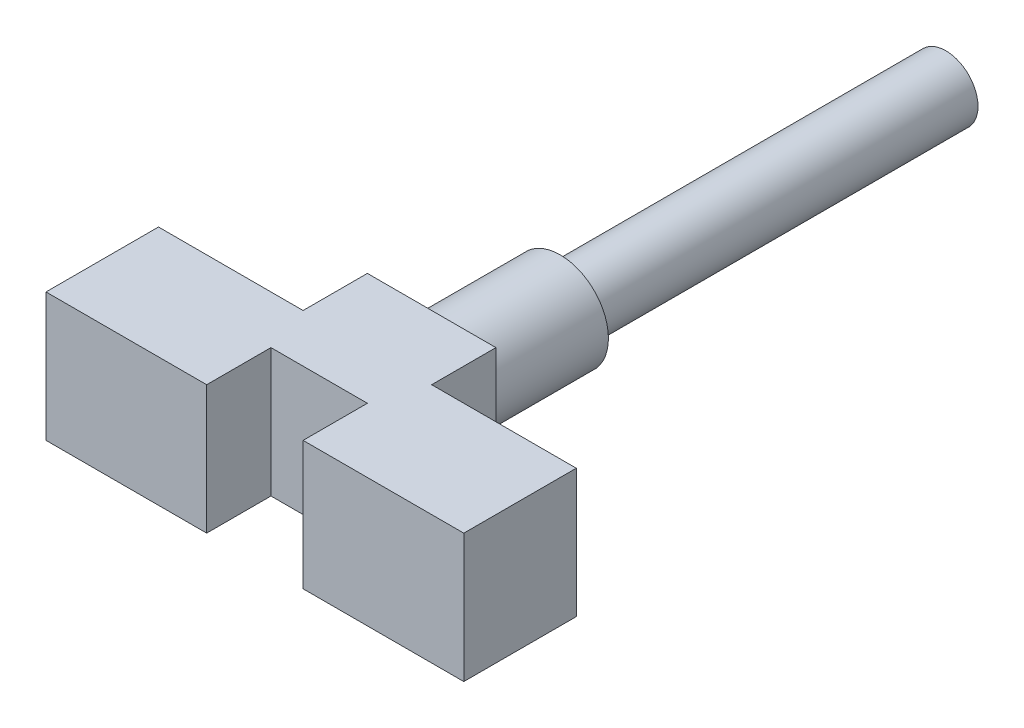
ISO-10303-21;
HEADER;
FILE_DESCRIPTION(('STEP AP214'),'2;1');
FILE_NAME('part.step','',(''),(''),'','','');
FILE_SCHEMA(('AUTOMOTIVE_DESIGN { 1 0 10303 214 1 1 1 1 }'));
ENDSEC;
DATA;
#1=APPLICATION_CONTEXT('core data for automotive mechanical design processes');
#2=APPLICATION_PROTOCOL_DEFINITION('international standard','automotive_design',2000,#1);
#3=PRODUCT_CONTEXT('',#1,'mechanical');
#4=PRODUCT('Part','Part','',(#3));
#5=PRODUCT_RELATED_PRODUCT_CATEGORY('part','',(#4));
#6=PRODUCT_DEFINITION_FORMATION('','',#4);
#7=PRODUCT_DEFINITION_CONTEXT('part definition',#1,'design');
#8=PRODUCT_DEFINITION('design','',#6,#7);
#9=PRODUCT_DEFINITION_SHAPE('','',#8);
#10=(LENGTH_UNIT() NAMED_UNIT(*) SI_UNIT(.MILLI.,.METRE.));
#11=(NAMED_UNIT(*) PLANE_ANGLE_UNIT() SI_UNIT($,.RADIAN.));
#12=(NAMED_UNIT(*) SI_UNIT($,.STERADIAN.) SOLID_ANGLE_UNIT());
#13=UNCERTAINTY_MEASURE_WITH_UNIT(LENGTH_MEASURE(1.E-05),#10,'distance_accuracy_value','');
#14=(GEOMETRIC_REPRESENTATION_CONTEXT(3) GLOBAL_UNCERTAINTY_ASSIGNED_CONTEXT((#13)) GLOBAL_UNIT_ASSIGNED_CONTEXT((#10,
#11,#12)) REPRESENTATION_CONTEXT('',''));
#15=CARTESIAN_POINT('',(0.,0.,0.));
#16=DIRECTION('',(0.,0.,1.));
#17=DIRECTION('',(1.,0.,0.));
#18=AXIS2_PLACEMENT_3D('',#15,#16,#17);
#19=CARTESIAN_POINT('',(0.,0.,-38.1));
#20=DIRECTION('',(0.,0.,-1.));
#21=DIRECTION('',(-1.,0.,0.));
#22=AXIS2_PLACEMENT_3D('',#19,#20,#21);
#23=PLANE('',#22);
#24=CARTESIAN_POINT('',(0.,0.,-38.1));
#25=DIRECTION('',(0.,0.,-1.));
#26=DIRECTION('',(-1.,0.,0.));
#27=AXIS2_PLACEMENT_3D('',#24,#25,#26);
#28=CIRCLE('',#27,9.525);
#29=CARTESIAN_POINT('',(-9.525,0.,-38.1));
#30=VERTEX_POINT('',#29);
#31=EDGE_CURVE('E157',#30,#30,#28,.T.);
#32=ORIENTED_EDGE('',*,*,#31,.T.);
#33=EDGE_LOOP('',(#32));
#34=FACE_BOUND('',#33,.T.);
#35=CARTESIAN_POINT('',(0.,0.,-38.1));
#36=DIRECTION('',(0.,0.,-1.));
#37=DIRECTION('',(-1.,0.,0.));
#38=AXIS2_PLACEMENT_3D('',#35,#36,#37);
#39=CIRCLE('',#38,6.35);
#40=CARTESIAN_POINT('',(6.35,0.,-38.1));
#41=VERTEX_POINT('',#40);
#42=EDGE_CURVE('E409',#41,#41,#39,.T.);
#43=ORIENTED_EDGE('',*,*,#42,.F.);
#44=EDGE_LOOP('',(#43));
#45=FACE_BOUND('',#44,.T.);
#46=ADVANCED_FACE('F31',(#34,#45),#23,.T.);
#47=CARTESIAN_POINT('',(12.7,12.7,-12.7));
#48=DIRECTION('',(0.,0.,1.));
#49=DIRECTION('',(1.,0.,0.));
#50=AXIS2_PLACEMENT_3D('',#47,#48,#49);
#51=PLANE('',#50);
#52=DIRECTION('',(-1.,0.,0.));
#53=VECTOR('',#52,1.);
#54=CARTESIAN_POINT('',(12.7,-12.7,-12.7));
#55=LINE('',#54,#53);
#56=CARTESIAN_POINT('',(12.7,-12.7,-12.7));
#57=VERTEX_POINT('',#56);
#58=CARTESIAN_POINT('',(-12.7,-12.7,-12.7));
#59=VERTEX_POINT('',#58);
#60=EDGE_CURVE('E156',#57,#59,#55,.T.);
#61=ORIENTED_EDGE('',*,*,#60,.T.);
#62=DIRECTION('',(0.,-1.,0.));
#63=VECTOR('',#62,1.);
#64=CARTESIAN_POINT('',(-12.7,12.7,-12.7));
#65=LINE('',#64,#63);
#66=CARTESIAN_POINT('',(-12.7,12.7,-12.7));
#67=VERTEX_POINT('',#66);
#68=EDGE_CURVE('E198',#67,#59,#65,.T.);
#69=ORIENTED_EDGE('',*,*,#68,.F.);
#70=DIRECTION('',(-1.,0.,0.));
#71=VECTOR('',#70,1.);
#72=CARTESIAN_POINT('',(12.7,12.7,-12.7));
#73=LINE('',#72,#71);
#74=CARTESIAN_POINT('',(12.7,12.7,-12.7));
#75=VERTEX_POINT('',#74);
#76=EDGE_CURVE('E104',#75,#67,#73,.T.);
#77=ORIENTED_EDGE('',*,*,#76,.F.);
#78=DIRECTION('',(0.,-1.,0.));
#79=VECTOR('',#78,1.);
#80=CARTESIAN_POINT('',(12.7,12.7,-12.7));
#81=LINE('',#80,#79);
#82=EDGE_CURVE('E40',#75,#57,#81,.T.);
#83=ORIENTED_EDGE('',*,*,#82,.T.);
#84=EDGE_LOOP('',(#61,#69,#77,#83));
#85=FACE_BOUND('',#84,.T.);
#86=CARTESIAN_POINT('',(0.,0.,-12.7));
#87=DIRECTION('',(0.,0.,1.));
#88=DIRECTION('',(1.,0.,0.));
#89=AXIS2_PLACEMENT_3D('',#86,#87,#88);
#90=CIRCLE('',#89,9.525);
#91=CARTESIAN_POINT('',(9.525,0.,-12.7));
#92=VERTEX_POINT('',#91);
#93=EDGE_CURVE('E11',#92,#92,#90,.F.);
#94=ORIENTED_EDGE('',*,*,#93,.F.);
#95=EDGE_LOOP('',(#94));
#96=FACE_BOUND('',#95,.T.);
#97=ADVANCED_FACE('F201',(#85,#96),#51,.F.);
#98=CARTESIAN_POINT('',(12.7,12.7,0.));
#99=DIRECTION('',(-1.,0.,0.));
#100=DIRECTION('',(0.,0.,1.));
#101=AXIS2_PLACEMENT_3D('',#98,#99,#100);
#102=PLANE('',#101);
#103=DIRECTION('',(0.,0.,-1.));
#104=VECTOR('',#103,1.);
#105=CARTESIAN_POINT('',(12.7,-12.7,0.));
#106=LINE('',#105,#104);
#107=CARTESIAN_POINT('',(12.7,-12.7,0.));
#108=VERTEX_POINT('',#107);
#109=EDGE_CURVE('E153',#108,#57,#106,.T.);
#110=ORIENTED_EDGE('',*,*,#109,.T.);
#111=ORIENTED_EDGE('',*,*,#82,.F.);
#112=DIRECTION('',(0.,0.,-1.));
#113=VECTOR('',#112,1.);
#114=CARTESIAN_POINT('',(12.7,12.7,0.));
#115=LINE('',#114,#113);
#116=CARTESIAN_POINT('',(12.7,12.7,0.));
#117=VERTEX_POINT('',#116);
#118=EDGE_CURVE('E176',#117,#75,#115,.T.);
#119=ORIENTED_EDGE('',*,*,#118,.F.);
#120=DIRECTION('',(0.,-1.,0.));
#121=VECTOR('',#120,1.);
#122=CARTESIAN_POINT('',(12.7,12.7,0.));
#123=LINE('',#122,#121);
#124=EDGE_CURVE('E149',#117,#108,#123,.T.);
#125=ORIENTED_EDGE('',*,*,#124,.T.);
#126=EDGE_LOOP('',(#110,#111,#119,#125));
#127=FACE_BOUND('',#126,.T.);
#128=ADVANCED_FACE('F33',(#127),#102,.F.);
#129=CARTESIAN_POINT('',(-12.7,12.7,-12.7));
#130=DIRECTION('',(1.,0.,0.));
#131=DIRECTION('',(0.,0.,-1.));
#132=AXIS2_PLACEMENT_3D('',#129,#130,#131);
#133=PLANE('',#132);
#134=DIRECTION('',(0.,0.,1.));
#135=VECTOR('',#134,1.);
#136=CARTESIAN_POINT('',(-12.7,-12.7,-12.7));
#137=LINE('',#136,#135);
#138=CARTESIAN_POINT('',(-12.7,-12.7,0.));
#139=VERTEX_POINT('',#138);
#140=EDGE_CURVE('E159',#59,#139,#137,.T.);
#141=ORIENTED_EDGE('',*,*,#140,.T.);
#142=DIRECTION('',(0.,-1.,0.));
#143=VECTOR('',#142,1.);
#144=CARTESIAN_POINT('',(-12.7,12.7,0.));
#145=LINE('',#144,#143);
#146=CARTESIAN_POINT('',(-12.7,12.7,0.));
#147=VERTEX_POINT('',#146);
#148=EDGE_CURVE('E195',#147,#139,#145,.T.);
#149=ORIENTED_EDGE('',*,*,#148,.F.);
#150=DIRECTION('',(0.,0.,1.));
#151=VECTOR('',#150,1.);
#152=CARTESIAN_POINT('',(-12.7,12.7,-12.7));
#153=LINE('',#152,#151);
#154=EDGE_CURVE('E222',#67,#147,#153,.T.);
#155=ORIENTED_EDGE('',*,*,#154,.F.);
#156=ORIENTED_EDGE('',*,*,#68,.T.);
#157=EDGE_LOOP('',(#141,#149,#155,#156));
#158=FACE_BOUND('',#157,.T.);
#159=ADVANCED_FACE('F213',(#158),#133,.F.);
#160=CARTESIAN_POINT('',(-12.7,12.7,0.));
#161=DIRECTION('',(0.,0.,1.));
#162=DIRECTION('',(1.,0.,0.));
#163=AXIS2_PLACEMENT_3D('',#160,#161,#162);
#164=PLANE('',#163);
#165=DIRECTION('',(-1.,0.,0.));
#166=VECTOR('',#165,1.);
#167=CARTESIAN_POINT('',(-12.7,-12.7,0.));
#168=LINE('',#167,#166);
#169=CARTESIAN_POINT('',(-41.275,-12.7,0.));
#170=VERTEX_POINT('',#169);
#171=EDGE_CURVE('E161',#139,#170,#168,.T.);
#172=ORIENTED_EDGE('',*,*,#171,.T.);
#173=DIRECTION('',(0.,-1.,0.));
#174=VECTOR('',#173,1.);
#175=CARTESIAN_POINT('',(-41.275,12.7,0.));
#176=LINE('',#175,#174);
#177=CARTESIAN_POINT('',(-41.275,12.7,0.));
#178=VERTEX_POINT('',#177);
#179=EDGE_CURVE('E192',#178,#170,#176,.T.);
#180=ORIENTED_EDGE('',*,*,#179,.F.);
#181=DIRECTION('',(-1.,0.,0.));
#182=VECTOR('',#181,1.);
#183=CARTESIAN_POINT('',(-12.7,12.7,0.));
#184=LINE('',#183,#182);
#185=EDGE_CURVE('E219',#147,#178,#184,.T.);
#186=ORIENTED_EDGE('',*,*,#185,.F.);
#187=ORIENTED_EDGE('',*,*,#148,.T.);
#188=EDGE_LOOP('',(#172,#180,#186,#187));
#189=FACE_BOUND('',#188,.T.);
#190=ADVANCED_FACE('F217',(#189),#164,.F.);
#191=CARTESIAN_POINT('',(-41.275,12.7,0.));
#192=DIRECTION('',(1.,0.,0.));
#193=DIRECTION('',(0.,0.,-1.));
#194=AXIS2_PLACEMENT_3D('',#191,#192,#193);
#195=PLANE('',#194);
#196=DIRECTION('',(0.,0.,1.));
#197=VECTOR('',#196,1.);
#198=CARTESIAN_POINT('',(-41.275,-12.7,0.));
#199=LINE('',#198,#197);
#200=CARTESIAN_POINT('',(-41.275,-12.7,22.225));
#201=VERTEX_POINT('',#200);
#202=EDGE_CURVE('E163',#170,#201,#199,.T.);
#203=ORIENTED_EDGE('',*,*,#202,.T.);
#204=DIRECTION('',(0.,-1.,0.));
#205=VECTOR('',#204,1.);
#206=CARTESIAN_POINT('',(-41.275,12.7,22.225));
#207=LINE('',#206,#205);
#208=CARTESIAN_POINT('',(-41.275,12.7,22.225));
#209=VERTEX_POINT('',#208);
#210=EDGE_CURVE('E189',#209,#201,#207,.T.);
#211=ORIENTED_EDGE('',*,*,#210,.F.);
#212=DIRECTION('',(0.,0.,1.));
#213=VECTOR('',#212,1.);
#214=CARTESIAN_POINT('',(-41.275,12.7,0.));
#215=LINE('',#214,#213);
#216=EDGE_CURVE('E221',#178,#209,#215,.T.);
#217=ORIENTED_EDGE('',*,*,#216,.F.);
#218=ORIENTED_EDGE('',*,*,#179,.T.);
#219=EDGE_LOOP('',(#203,#211,#217,#218));
#220=FACE_BOUND('',#219,.T.);
#221=ADVANCED_FACE('F253',(#220),#195,.F.);
#222=CARTESIAN_POINT('',(-41.275,12.7,22.225));
#223=DIRECTION('',(0.,0.,-1.));
#224=DIRECTION('',(-1.,0.,0.));
#225=AXIS2_PLACEMENT_3D('',#222,#223,#224);
#226=PLANE('',#225);
#227=DIRECTION('',(1.,0.,0.));
#228=VECTOR('',#227,1.);
#229=CARTESIAN_POINT('',(-41.275,-12.7,22.225));
#230=LINE('',#229,#228);
#231=CARTESIAN_POINT('',(-9.525,-12.7,22.225));
#232=VERTEX_POINT('',#231);
#233=EDGE_CURVE('E165',#201,#232,#230,.T.);
#234=ORIENTED_EDGE('',*,*,#233,.T.);
#235=DIRECTION('',(0.,-1.,0.));
#236=VECTOR('',#235,1.);
#237=CARTESIAN_POINT('',(-9.525,12.7,22.225));
#238=LINE('',#237,#236);
#239=CARTESIAN_POINT('',(-9.525,12.7,22.225));
#240=VERTEX_POINT('',#239);
#241=EDGE_CURVE('E186',#240,#232,#238,.T.);
#242=ORIENTED_EDGE('',*,*,#241,.F.);
#243=DIRECTION('',(1.,0.,0.));
#244=VECTOR('',#243,1.);
#245=CARTESIAN_POINT('',(-41.275,12.7,22.225));
#246=LINE('',#245,#244);
#247=EDGE_CURVE('E224',#209,#240,#246,.T.);
#248=ORIENTED_EDGE('',*,*,#247,.F.);
#249=ORIENTED_EDGE('',*,*,#210,.T.);
#250=EDGE_LOOP('',(#234,#242,#248,#249));
#251=FACE_BOUND('',#250,.T.);
#252=ADVANCED_FACE('F250',(#251),#226,.F.);
#253=CARTESIAN_POINT('',(-9.525,12.7,22.225));
#254=DIRECTION('',(-1.,0.,0.));
#255=DIRECTION('',(0.,0.,1.));
#256=AXIS2_PLACEMENT_3D('',#253,#254,#255);
#257=PLANE('',#256);
#258=DIRECTION('',(0.,0.,-1.));
#259=VECTOR('',#258,1.);
#260=CARTESIAN_POINT('',(-9.525,-12.7,22.225));
#261=LINE('',#260,#259);
#262=CARTESIAN_POINT('',(-9.525,-12.7,9.525));
#263=VERTEX_POINT('',#262);
#264=EDGE_CURVE('E167',#232,#263,#261,.T.);
#265=ORIENTED_EDGE('',*,*,#264,.T.);
#266=DIRECTION('',(0.,-1.,0.));
#267=VECTOR('',#266,1.);
#268=CARTESIAN_POINT('',(-9.525,12.7,9.525));
#269=LINE('',#268,#267);
#270=CARTESIAN_POINT('',(-9.525,12.7,9.525));
#271=VERTEX_POINT('',#270);
#272=EDGE_CURVE('E183',#271,#263,#269,.T.);
#273=ORIENTED_EDGE('',*,*,#272,.F.);
#274=DIRECTION('',(0.,0.,-1.));
#275=VECTOR('',#274,1.);
#276=CARTESIAN_POINT('',(-9.525,12.7,22.225));
#277=LINE('',#276,#275);
#278=EDGE_CURVE('E230',#240,#271,#277,.T.);
#279=ORIENTED_EDGE('',*,*,#278,.F.);
#280=ORIENTED_EDGE('',*,*,#241,.T.);
#281=EDGE_LOOP('',(#265,#273,#279,#280));
#282=FACE_BOUND('',#281,.T.);
#283=ADVANCED_FACE('F246',(#282),#257,.F.);
#284=CARTESIAN_POINT('',(-9.525,12.7,9.525));
#285=DIRECTION('',(0.,0.,-1.));
#286=DIRECTION('',(-1.,0.,0.));
#287=AXIS2_PLACEMENT_3D('',#284,#285,#286);
#288=PLANE('',#287);
#289=DIRECTION('',(1.,0.,0.));
#290=VECTOR('',#289,1.);
#291=CARTESIAN_POINT('',(-9.525,-12.7,9.525));
#292=LINE('',#291,#290);
#293=CARTESIAN_POINT('',(9.525,-12.7,9.525));
#294=VERTEX_POINT('',#293);
#295=EDGE_CURVE('E169',#263,#294,#292,.T.);
#296=ORIENTED_EDGE('',*,*,#295,.T.);
#297=DIRECTION('',(0.,-1.,0.));
#298=VECTOR('',#297,1.);
#299=CARTESIAN_POINT('',(9.525,12.7,9.525));
#300=LINE('',#299,#298);
#301=CARTESIAN_POINT('',(9.525,12.7,9.525));
#302=VERTEX_POINT('',#301);
#303=EDGE_CURVE('E180',#302,#294,#300,.T.);
#304=ORIENTED_EDGE('',*,*,#303,.F.);
#305=DIRECTION('',(1.,0.,0.));
#306=VECTOR('',#305,1.);
#307=CARTESIAN_POINT('',(-9.525,12.7,9.525));
#308=LINE('',#307,#306);
#309=EDGE_CURVE('E232',#271,#302,#308,.T.);
#310=ORIENTED_EDGE('',*,*,#309,.F.);
#311=ORIENTED_EDGE('',*,*,#272,.T.);
#312=EDGE_LOOP('',(#296,#304,#310,#311));
#313=FACE_BOUND('',#312,.T.);
#314=ADVANCED_FACE('F238',(#313),#288,.F.);
#315=CARTESIAN_POINT('',(9.525,12.7,9.525));
#316=DIRECTION('',(1.,0.,0.));
#317=DIRECTION('',(0.,0.,-1.));
#318=AXIS2_PLACEMENT_3D('',#315,#316,#317);
#319=PLANE('',#318);
#320=DIRECTION('',(0.,0.,1.));
#321=VECTOR('',#320,1.);
#322=CARTESIAN_POINT('',(9.525,-12.7,9.525));
#323=LINE('',#322,#321);
#324=CARTESIAN_POINT('',(9.525,-12.7,22.225));
#325=VERTEX_POINT('',#324);
#326=EDGE_CURVE('E171',#294,#325,#323,.T.);
#327=ORIENTED_EDGE('',*,*,#326,.T.);
#328=DIRECTION('',(0.,-1.,0.));
#329=VECTOR('',#328,1.);
#330=CARTESIAN_POINT('',(9.525,12.7,22.225));
#331=LINE('',#330,#329);
#332=CARTESIAN_POINT('',(9.525,12.7,22.225));
#333=VERTEX_POINT('',#332);
#334=EDGE_CURVE('E144',#333,#325,#331,.T.);
#335=ORIENTED_EDGE('',*,*,#334,.F.);
#336=DIRECTION('',(0.,0.,1.));
#337=VECTOR('',#336,1.);
#338=CARTESIAN_POINT('',(9.525,12.7,9.525));
#339=LINE('',#338,#337);
#340=EDGE_CURVE('E135',#302,#333,#339,.T.);
#341=ORIENTED_EDGE('',*,*,#340,.F.);
#342=ORIENTED_EDGE('',*,*,#303,.T.);
#343=EDGE_LOOP('',(#327,#335,#341,#342));
#344=FACE_BOUND('',#343,.T.);
#345=ADVANCED_FACE('F242',(#344),#319,.F.);
#346=CARTESIAN_POINT('',(9.525,12.7,22.225));
#347=DIRECTION('',(0.,0.,-1.));
#348=DIRECTION('',(-1.,0.,0.));
#349=AXIS2_PLACEMENT_3D('',#346,#347,#348);
#350=PLANE('',#349);
#351=DIRECTION('',(1.,0.,0.));
#352=VECTOR('',#351,1.);
#353=CARTESIAN_POINT('',(9.525,-12.7,22.225));
#354=LINE('',#353,#352);
#355=CARTESIAN_POINT('',(41.275,-12.7,22.225));
#356=VERTEX_POINT('',#355);
#357=EDGE_CURVE('E143',#325,#356,#354,.T.);
#358=ORIENTED_EDGE('',*,*,#357,.T.);
#359=DIRECTION('',(0.,-1.,0.));
#360=VECTOR('',#359,1.);
#361=CARTESIAN_POINT('',(41.275,12.7,22.225));
#362=LINE('',#361,#360);
#363=CARTESIAN_POINT('',(41.275,12.7,22.225));
#364=VERTEX_POINT('',#363);
#365=EDGE_CURVE('E140',#364,#356,#362,.T.);
#366=ORIENTED_EDGE('',*,*,#365,.F.);
#367=DIRECTION('',(1.,0.,0.));
#368=VECTOR('',#367,1.);
#369=CARTESIAN_POINT('',(9.525,12.7,22.225));
#370=LINE('',#369,#368);
#371=EDGE_CURVE('E129',#333,#364,#370,.T.);
#372=ORIENTED_EDGE('',*,*,#371,.F.);
#373=ORIENTED_EDGE('',*,*,#334,.T.);
#374=EDGE_LOOP('',(#358,#366,#372,#373));
#375=FACE_BOUND('',#374,.T.);
#376=ADVANCED_FACE('F141',(#375),#350,.F.);
#377=CARTESIAN_POINT('',(41.275,12.7,22.225));
#378=DIRECTION('',(-1.,0.,0.));
#379=DIRECTION('',(0.,0.,1.));
#380=AXIS2_PLACEMENT_3D('',#377,#378,#379);
#381=PLANE('',#380);
#382=DIRECTION('',(0.,0.,-1.));
#383=VECTOR('',#382,1.);
#384=CARTESIAN_POINT('',(41.275,-12.7,22.225));
#385=LINE('',#384,#383);
#386=CARTESIAN_POINT('',(41.275,-12.7,0.));
#387=VERTEX_POINT('',#386);
#388=EDGE_CURVE('E89',#356,#387,#385,.T.);
#389=ORIENTED_EDGE('',*,*,#388,.T.);
#390=DIRECTION('',(0.,-1.,0.));
#391=VECTOR('',#390,1.);
#392=CARTESIAN_POINT('',(41.275,12.7,0.));
#393=LINE('',#392,#391);
#394=CARTESIAN_POINT('',(41.275,12.7,0.));
#395=VERTEX_POINT('',#394);
#396=EDGE_CURVE('E145',#395,#387,#393,.T.);
#397=ORIENTED_EDGE('',*,*,#396,.F.);
#398=DIRECTION('',(0.,0.,-1.));
#399=VECTOR('',#398,1.);
#400=CARTESIAN_POINT('',(41.275,12.7,22.225));
#401=LINE('',#400,#399);
#402=EDGE_CURVE('E133',#364,#395,#401,.T.);
#403=ORIENTED_EDGE('',*,*,#402,.F.);
#404=ORIENTED_EDGE('',*,*,#365,.T.);
#405=EDGE_LOOP('',(#389,#397,#403,#404));
#406=FACE_BOUND('',#405,.T.);
#407=ADVANCED_FACE('F147',(#406),#381,.F.);
#408=CARTESIAN_POINT('',(41.275,12.7,0.));
#409=DIRECTION('',(0.,0.,1.));
#410=DIRECTION('',(1.,0.,0.));
#411=AXIS2_PLACEMENT_3D('',#408,#409,#410);
#412=PLANE('',#411);
#413=DIRECTION('',(-1.,0.,0.));
#414=VECTOR('',#413,1.);
#415=CARTESIAN_POINT('',(41.275,-12.7,0.));
#416=LINE('',#415,#414);
#417=EDGE_CURVE('E95',#387,#108,#416,.T.);
#418=ORIENTED_EDGE('',*,*,#417,.T.);
#419=ORIENTED_EDGE('',*,*,#124,.F.);
#420=DIRECTION('',(-1.,0.,0.));
#421=VECTOR('',#420,1.);
#422=CARTESIAN_POINT('',(41.275,12.7,0.));
#423=LINE('',#422,#421);
#424=EDGE_CURVE('E48',#395,#117,#423,.T.);
#425=ORIENTED_EDGE('',*,*,#424,.F.);
#426=ORIENTED_EDGE('',*,*,#396,.T.);
#427=EDGE_LOOP('',(#418,#419,#425,#426));
#428=FACE_BOUND('',#427,.T.);
#429=ADVANCED_FACE('F280',(#428),#412,.F.);
#430=CARTESIAN_POINT('',(12.7,12.7,-12.7));
#431=DIRECTION('',(0.,1.,0.));
#432=DIRECTION('',(0.,0.,1.));
#433=AXIS2_PLACEMENT_3D('',#430,#431,#432);
#434=PLANE('',#433);
#435=ORIENTED_EDGE('',*,*,#118,.T.);
#436=ORIENTED_EDGE('',*,*,#76,.T.);
#437=ORIENTED_EDGE('',*,*,#154,.T.);
#438=ORIENTED_EDGE('',*,*,#185,.T.);
#439=ORIENTED_EDGE('',*,*,#216,.T.);
#440=ORIENTED_EDGE('',*,*,#247,.T.);
#441=ORIENTED_EDGE('',*,*,#278,.T.);
#442=ORIENTED_EDGE('',*,*,#309,.T.);
#443=ORIENTED_EDGE('',*,*,#340,.T.);
#444=ORIENTED_EDGE('',*,*,#371,.T.);
#445=ORIENTED_EDGE('',*,*,#402,.T.);
#446=ORIENTED_EDGE('',*,*,#424,.T.);
#447=EDGE_LOOP('',(#435,#436,#437,#438,#439,#440,#441,#442,#443,#444,#445,#446));
#448=FACE_BOUND('',#447,.T.);
#449=ADVANCED_FACE('F131',(#448),#434,.T.);
#450=CARTESIAN_POINT('',(12.7,-12.7,-12.7));
#451=DIRECTION('',(0.,1.,0.));
#452=DIRECTION('',(0.,0.,1.));
#453=AXIS2_PLACEMENT_3D('',#450,#451,#452);
#454=PLANE('',#453);
#455=ORIENTED_EDGE('',*,*,#109,.F.);
#456=ORIENTED_EDGE('',*,*,#417,.F.);
#457=ORIENTED_EDGE('',*,*,#388,.F.);
#458=ORIENTED_EDGE('',*,*,#357,.F.);
#459=ORIENTED_EDGE('',*,*,#326,.F.);
#460=ORIENTED_EDGE('',*,*,#295,.F.);
#461=ORIENTED_EDGE('',*,*,#264,.F.);
#462=ORIENTED_EDGE('',*,*,#233,.F.);
#463=ORIENTED_EDGE('',*,*,#202,.F.);
#464=ORIENTED_EDGE('',*,*,#171,.F.);
#465=ORIENTED_EDGE('',*,*,#140,.F.);
#466=ORIENTED_EDGE('',*,*,#60,.F.);
#467=EDGE_LOOP('',(#455,#456,#457,#458,#459,#460,#461,#462,#463,#464,#465,#466));
#468=FACE_BOUND('',#467,.T.);
#469=ADVANCED_FACE('F207',(#468),#454,.F.);
#470=CARTESIAN_POINT('',(0.,0.,-38.1));
#471=DIRECTION('',(0.,0.,1.));
#472=DIRECTION('',(1.,0.,0.));
#473=AXIS2_PLACEMENT_3D('',#470,#471,#472);
#474=CYLINDRICAL_SURFACE('',#473,9.525);
#475=ORIENTED_EDGE('',*,*,#31,.F.);
#476=EDGE_LOOP('',(#475));
#477=FACE_BOUND('',#476,.T.);
#478=ORIENTED_EDGE('',*,*,#93,.T.);
#479=EDGE_LOOP('',(#478));
#480=FACE_BOUND('',#479,.T.);
#481=ADVANCED_FACE('F274',(#477,#480),#474,.T.);
#482=CARTESIAN_POINT('',(0.,0.,-114.3));
#483=DIRECTION('',(0.,0.,1.));
#484=DIRECTION('',(1.,0.,0.));
#485=AXIS2_PLACEMENT_3D('',#482,#483,#484);
#486=CYLINDRICAL_SURFACE('',#485,6.35);
#487=CARTESIAN_POINT('',(0.,0.,-114.3));
#488=DIRECTION('',(0.,0.,-1.));
#489=DIRECTION('',(-1.,0.,0.));
#490=AXIS2_PLACEMENT_3D('',#487,#488,#489);
#491=CIRCLE('',#490,6.35);
#492=CARTESIAN_POINT('',(6.35,0.,-114.3));
#493=VERTEX_POINT('',#492);
#494=EDGE_CURVE('E408',#493,#493,#491,.T.);
#495=CARTESIAN_POINT('',(6.35,0.,-114.3));
#496=CARTESIAN_POINT('',(6.35,0.,-113.50625));
#497=CARTESIAN_POINT('',(6.35,0.,-112.7125));
#498=CARTESIAN_POINT('',(6.35,0.,-111.125));
#499=CARTESIAN_POINT('',(6.35,0.,-110.33125));
#500=CARTESIAN_POINT('',(6.35,0.,-108.74375));
#501=CARTESIAN_POINT('',(6.35,0.,-107.95));
#502=CARTESIAN_POINT('',(6.35,0.,-106.3625));
#503=CARTESIAN_POINT('',(6.35,0.,-105.56875));
#504=CARTESIAN_POINT('',(6.35,0.,-103.98125));
#505=CARTESIAN_POINT('',(6.35,0.,-103.1875));
#506=CARTESIAN_POINT('',(6.35,0.,-101.6));
#507=CARTESIAN_POINT('',(6.35,0.,-100.80625));
#508=CARTESIAN_POINT('',(6.35,0.,-99.21875));
#509=CARTESIAN_POINT('',(6.35,0.,-98.425));
#510=CARTESIAN_POINT('',(6.35,0.,-96.8375));
#511=CARTESIAN_POINT('',(6.35,0.,-96.04375));
#512=CARTESIAN_POINT('',(6.35,0.,-94.45625));
#513=CARTESIAN_POINT('',(6.35,0.,-93.6625));
#514=CARTESIAN_POINT('',(6.35,0.,-92.075));
#515=CARTESIAN_POINT('',(6.35,0.,-91.28125));
#516=CARTESIAN_POINT('',(6.35,0.,-89.69375));
#517=CARTESIAN_POINT('',(6.35,0.,-88.9));
#518=CARTESIAN_POINT('',(6.35,0.,-87.3125));
#519=CARTESIAN_POINT('',(6.35,0.,-86.51875));
#520=CARTESIAN_POINT('',(6.35,0.,-84.93125));
#521=CARTESIAN_POINT('',(6.35,0.,-84.1375));
#522=CARTESIAN_POINT('',(6.35,0.,-82.55));
#523=CARTESIAN_POINT('',(6.35,0.,-81.75625));
#524=CARTESIAN_POINT('',(6.35,0.,-80.16875));
#525=CARTESIAN_POINT('',(6.35,0.,-79.375));
#526=CARTESIAN_POINT('',(6.35,0.,-77.7875));
#527=CARTESIAN_POINT('',(6.35,0.,-76.99375));
#528=CARTESIAN_POINT('',(6.35,0.,-75.40625));
#529=CARTESIAN_POINT('',(6.35,0.,-74.6125));
#530=CARTESIAN_POINT('',(6.35,0.,-73.025));
#531=CARTESIAN_POINT('',(6.35,0.,-72.23125));
#532=CARTESIAN_POINT('',(6.35,0.,-70.64375));
#533=CARTESIAN_POINT('',(6.35,0.,-69.85));
#534=CARTESIAN_POINT('',(6.35,0.,-68.2625));
#535=CARTESIAN_POINT('',(6.35,0.,-67.46875));
#536=CARTESIAN_POINT('',(6.35,0.,-65.88125));
#537=CARTESIAN_POINT('',(6.35,0.,-65.0875));
#538=CARTESIAN_POINT('',(6.35,0.,-63.5));
#539=CARTESIAN_POINT('',(6.35,0.,-62.70625));
#540=CARTESIAN_POINT('',(6.35,0.,-61.11875));
#541=CARTESIAN_POINT('',(6.35,0.,-60.325));
#542=CARTESIAN_POINT('',(6.35,0.,-58.7375));
#543=CARTESIAN_POINT('',(6.35,0.,-57.94375));
#544=CARTESIAN_POINT('',(6.35,0.,-56.35625));
#545=CARTESIAN_POINT('',(6.35,0.,-55.5625));
#546=CARTESIAN_POINT('',(6.35,0.,-53.975));
#547=CARTESIAN_POINT('',(6.35,0.,-53.18125));
#548=CARTESIAN_POINT('',(6.35,0.,-51.59375));
#549=CARTESIAN_POINT('',(6.35,0.,-50.8));
#550=CARTESIAN_POINT('',(6.35,0.,-49.2125));
#551=CARTESIAN_POINT('',(6.35,0.,-48.41875));
#552=CARTESIAN_POINT('',(6.35,0.,-46.83125));
#553=CARTESIAN_POINT('',(6.35,0.,-46.0375));
#554=CARTESIAN_POINT('',(6.35,0.,-44.45));
#555=CARTESIAN_POINT('',(6.35,0.,-43.65625));
#556=CARTESIAN_POINT('',(6.35,0.,-42.06875));
#557=CARTESIAN_POINT('',(6.35,0.,-41.275));
#558=CARTESIAN_POINT('',(6.35,0.,-39.6875));
#559=CARTESIAN_POINT('',(6.35,0.,-38.89375));
#560=CARTESIAN_POINT('',(6.35,0.,-38.1));
#561=B_SPLINE_CURVE_WITH_KNOTS('',3,(#495,#496,#497,#498,#499,#500,#501,#502,#503,#504,#505,
#506,#507,#508,#509,#510,#511,#512,#513,#514,#515,#516,#517,#518,#519,#520,#521,#522,#523,#524,
#525,#526,#527,#528,#529,#530,#531,#532,#533,#534,#535,#536,#537,#538,#539,#540,#541,#542,#543,
#544,#545,#546,#547,#548,#549,#550,#551,#552,#553,#554,#555,#556,#557,#558,#559,#560),
.UNSPECIFIED.,.F.,.F.,(4,2,2,2,2,2,2,2,2,2,2,2,2,2,2,2,2,2,2,2,2,2,2,2,2,2,2,2,2,2,2,2,4),(0.,
2.38124999999999,4.76249999999999,7.14374999999999,9.52499999999999,11.90625,14.2875,16.66875,
19.05,21.43125,23.8125,26.19375,28.575,30.95625,33.3375,35.71875,38.1,40.48125,42.8625,45.24375,
47.625,50.00625,52.3875,54.76875,57.15,59.53125,61.9125,64.29375,66.675,69.05625,71.4375,
73.81875,76.2),.UNSPECIFIED.);
#562=EDGE_CURVE('BSEAM272',#493,#41,#561,.T.);
#563=ORIENTED_EDGE('',*,*,#494,.F.);
#564=ORIENTED_EDGE('',*,*,#42,.T.);
#565=ORIENTED_EDGE('',*,*,#562,.T.);
#566=ORIENTED_EDGE('',*,*,#562,.F.);
#567=EDGE_LOOP('',(#563,#565,#564,#566));
#568=FACE_BOUND('',#567,.T.);
#569=ADVANCED_FACE('F272',(#568),#486,.T.);
#570=CARTESIAN_POINT('',(0.,0.,-114.3));
#571=DIRECTION('',(0.,0.,-1.));
#572=DIRECTION('',(-1.,0.,0.));
#573=AXIS2_PLACEMENT_3D('',#570,#571,#572);
#574=PLANE('',#573);
#575=ORIENTED_EDGE('',*,*,#494,.T.);
#576=EDGE_LOOP('',(#575));
#577=FACE_BOUND('',#576,.T.);
#578=ADVANCED_FACE('F337',(#577),#574,.T.);
#579=CLOSED_SHELL('',(#46,#97,#128,#159,#190,#221,#252,#283,#314,#345,#376,#407,#429,#449,#469,
#481,#569,#578));
#580=MANIFOLD_SOLID_BREP('B2',#579);
#581=ADVANCED_BREP_SHAPE_REPRESENTATION('',(#18,#580),#14);
#582=SHAPE_DEFINITION_REPRESENTATION(#9,#581);
ENDSEC;
END-ISO-10303-21;
